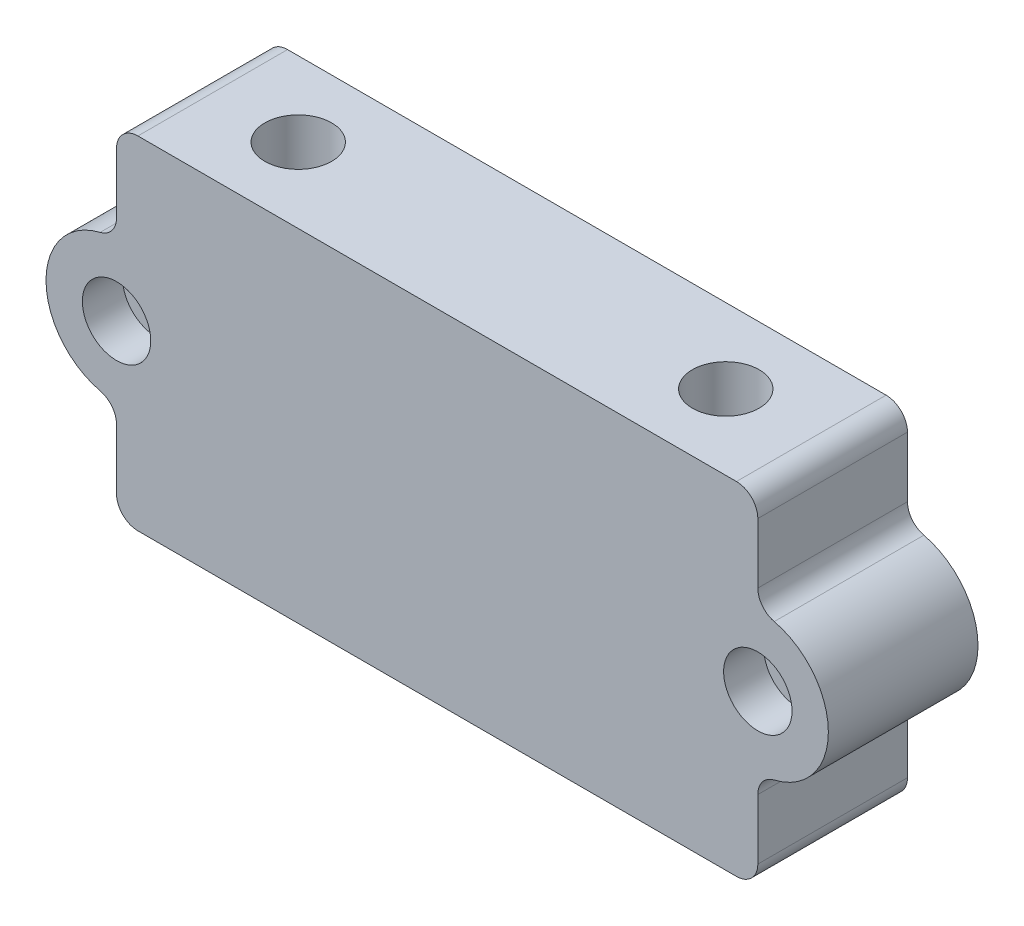
ISO-10303-21;
HEADER;
FILE_DESCRIPTION(('STEP AP214'),'2;1');
FILE_NAME('part.step','',(''),(''),'','','');
FILE_SCHEMA(('AUTOMOTIVE_DESIGN { 1 0 10303 214 1 1 1 1 }'));
ENDSEC;
DATA;
#1=APPLICATION_CONTEXT('core data for automotive mechanical design processes');
#2=APPLICATION_PROTOCOL_DEFINITION('international standard','automotive_design',2000,#1);
#3=PRODUCT_CONTEXT('',#1,'mechanical');
#4=PRODUCT('Part','Part','',(#3));
#5=PRODUCT_RELATED_PRODUCT_CATEGORY('part','',(#4));
#6=PRODUCT_DEFINITION_FORMATION('','',#4);
#7=PRODUCT_DEFINITION_CONTEXT('part definition',#1,'design');
#8=PRODUCT_DEFINITION('design','',#6,#7);
#9=PRODUCT_DEFINITION_SHAPE('','',#8);
#10=(LENGTH_UNIT() NAMED_UNIT(*) SI_UNIT(.MILLI.,.METRE.));
#11=(NAMED_UNIT(*) PLANE_ANGLE_UNIT() SI_UNIT($,.RADIAN.));
#12=(NAMED_UNIT(*) SI_UNIT($,.STERADIAN.) SOLID_ANGLE_UNIT());
#13=UNCERTAINTY_MEASURE_WITH_UNIT(LENGTH_MEASURE(1.E-05),#10,'distance_accuracy_value','');
#14=(GEOMETRIC_REPRESENTATION_CONTEXT(3) GLOBAL_UNCERTAINTY_ASSIGNED_CONTEXT((#13)) GLOBAL_UNIT_ASSIGNED_CONTEXT((#10,
#11,#12)) REPRESENTATION_CONTEXT('',''));
#15=CARTESIAN_POINT('',(0.,0.,0.));
#16=DIRECTION('',(0.,0.,1.));
#17=DIRECTION('',(1.,0.,0.));
#18=AXIS2_PLACEMENT_3D('',#15,#16,#17);
#19=CARTESIAN_POINT('',(-84.93125,0.,-17.78));
#20=DIRECTION('',(0.,0.,1.));
#21=DIRECTION('',(1.,0.,0.));
#22=AXIS2_PLACEMENT_3D('',#19,#20,#21);
#23=CYLINDRICAL_SURFACE('',#22,2.4892);
#24=CARTESIAN_POINT('',(-84.93125,0.,-17.78));
#25=DIRECTION('',(0.,0.,1.));
#26=DIRECTION('',(1.,0.,0.));
#27=AXIS2_PLACEMENT_3D('',#24,#25,#26);
#28=CIRCLE('',#27,2.4892);
#29=CARTESIAN_POINT('',(-82.44205,0.,-17.78));
#30=VERTEX_POINT('',#29);
#31=EDGE_CURVE('E261',#30,#30,#28,.T.);
#32=ORIENTED_EDGE('',*,*,#31,.F.);
#33=EDGE_LOOP('',(#32));
#34=FACE_BOUND('',#33,.T.);
#35=CARTESIAN_POINT('',(-84.93125,0.,-4.7752));
#36=DIRECTION('',(0.,0.,1.));
#37=DIRECTION('',(1.,0.,0.));
#38=AXIS2_PLACEMENT_3D('',#35,#36,#37);
#39=CIRCLE('',#38,2.4892);
#40=CARTESIAN_POINT('',(-82.44205,0.,-4.7752));
#41=VERTEX_POINT('',#40);
#42=EDGE_CURVE('E44',#41,#41,#39,.F.);
#43=ORIENTED_EDGE('',*,*,#42,.F.);
#44=EDGE_LOOP('',(#43));
#45=FACE_BOUND('',#44,.T.);
#46=ADVANCED_FACE('F40',(#34,#45),#23,.F.);
#47=CARTESIAN_POINT('',(-8.73125,0.,-17.78));
#48=DIRECTION('',(0.,0.,1.));
#49=DIRECTION('',(1.,0.,0.));
#50=AXIS2_PLACEMENT_3D('',#47,#48,#49);
#51=CYLINDRICAL_SURFACE('',#50,2.4892);
#52=CARTESIAN_POINT('',(-8.73125,0.,-17.78));
#53=DIRECTION('',(0.,0.,1.));
#54=DIRECTION('',(1.,0.,0.));
#55=AXIS2_PLACEMENT_3D('',#52,#53,#54);
#56=CIRCLE('',#55,2.4892);
#57=CARTESIAN_POINT('',(-6.24204999999999,0.,-17.78));
#58=VERTEX_POINT('',#57);
#59=EDGE_CURVE('E244',#58,#58,#56,.T.);
#60=ORIENTED_EDGE('',*,*,#59,.F.);
#61=EDGE_LOOP('',(#60));
#62=FACE_BOUND('',#61,.T.);
#63=CARTESIAN_POINT('',(-8.73125,0.,-4.7752));
#64=DIRECTION('',(0.,0.,1.));
#65=DIRECTION('',(1.,0.,0.));
#66=AXIS2_PLACEMENT_3D('',#63,#64,#65);
#67=CIRCLE('',#66,2.4892);
#68=CARTESIAN_POINT('',(-6.24204999999999,0.,-4.7752));
#69=VERTEX_POINT('',#68);
#70=EDGE_CURVE('E323',#69,#69,#67,.F.);
#71=ORIENTED_EDGE('',*,*,#70,.F.);
#72=EDGE_LOOP('',(#71));
#73=FACE_BOUND('',#72,.T.);
#74=ADVANCED_FACE('F443',(#62,#73),#51,.F.);
#75=CARTESIAN_POINT('',(-93.6625,20.32,-17.78));
#76=DIRECTION('',(0.,1.,0.));
#77=DIRECTION('',(0.,0.,1.));
#78=AXIS2_PLACEMENT_3D('',#75,#76,#77);
#79=PLANE('',#78);
#80=DIRECTION('',(-1.,0.,0.));
#81=VECTOR('',#80,1.);
#82=CARTESIAN_POINT('',(-93.6625,20.32,0.));
#83=LINE('',#82,#81);
#84=CARTESIAN_POINT('',(-11.27125,20.32,0.));
#85=VERTEX_POINT('',#84);
#86=CARTESIAN_POINT('',(-82.39125,20.32,0.));
#87=VERTEX_POINT('',#86);
#88=EDGE_CURVE('E265',#85,#87,#83,.T.);
#89=ORIENTED_EDGE('',*,*,#88,.F.);
#90=DIRECTION('',(0.,0.,1.));
#91=VECTOR('',#90,1.);
#92=CARTESIAN_POINT('',(-11.27125,20.32,-17.78));
#93=LINE('',#92,#91);
#94=CARTESIAN_POINT('',(-11.27125,20.32,-17.78));
#95=VERTEX_POINT('',#94);
#96=EDGE_CURVE('E319',#85,#95,#93,.F.);
#97=ORIENTED_EDGE('',*,*,#96,.T.);
#98=DIRECTION('',(-1.,0.,0.));
#99=VECTOR('',#98,1.);
#100=CARTESIAN_POINT('',(-93.6625,20.32,-17.78));
#101=LINE('',#100,#99);
#102=CARTESIAN_POINT('',(-82.39125,20.32,-17.78));
#103=VERTEX_POINT('',#102);
#104=EDGE_CURVE('E266',#95,#103,#101,.T.);
#105=ORIENTED_EDGE('',*,*,#104,.T.);
#106=DIRECTION('',(0.,0.,1.));
#107=VECTOR('',#106,1.);
#108=CARTESIAN_POINT('',(-82.39125,20.32,0.));
#109=LINE('',#108,#107);
#110=EDGE_CURVE('E315',#103,#87,#109,.T.);
#111=ORIENTED_EDGE('',*,*,#110,.T.);
#112=EDGE_LOOP('',(#89,#97,#105,#111));
#113=FACE_BOUND('',#112,.T.);
#114=CARTESIAN_POINT('',(-72.23125,20.32,-8.89));
#115=DIRECTION('',(0.,1.,0.));
#116=DIRECTION('',(0.,0.,1.));
#117=AXIS2_PLACEMENT_3D('',#114,#115,#116);
#118=CIRCLE('',#117,3.96874999999999);
#119=CARTESIAN_POINT('',(-72.23125,20.32,-4.92125000000001));
#120=VERTEX_POINT('',#119);
#121=EDGE_CURVE('E245',#120,#120,#118,.T.);
#122=ORIENTED_EDGE('',*,*,#121,.F.);
#123=EDGE_LOOP('',(#122));
#124=FACE_BOUND('',#123,.T.);
#125=CARTESIAN_POINT('',(-21.43125,20.32,-8.89));
#126=DIRECTION('',(0.,1.,0.));
#127=DIRECTION('',(0.,0.,1.));
#128=AXIS2_PLACEMENT_3D('',#125,#126,#127);
#129=CIRCLE('',#128,3.96875);
#130=CARTESIAN_POINT('',(-21.43125,20.32,-4.92125000000001));
#131=VERTEX_POINT('',#130);
#132=EDGE_CURVE('E253',#131,#131,#129,.T.);
#133=ORIENTED_EDGE('',*,*,#132,.F.);
#134=EDGE_LOOP('',(#133));
#135=FACE_BOUND('',#134,.T.);
#136=ADVANCED_FACE('F397',(#113,#124,#135),#79,.T.);
#137=CARTESIAN_POINT('',(-93.6625,-20.32,-17.78));
#138=DIRECTION('',(0.,-1.,0.));
#139=DIRECTION('',(0.,0.,-1.));
#140=AXIS2_PLACEMENT_3D('',#137,#138,#139);
#141=PLANE('',#140);
#142=DIRECTION('',(1.,0.,0.));
#143=VECTOR('',#142,1.);
#144=CARTESIAN_POINT('',(-93.6625,-20.32,-17.78));
#145=LINE('',#144,#143);
#146=CARTESIAN_POINT('',(-82.39125,-20.32,-17.78));
#147=VERTEX_POINT('',#146);
#148=CARTESIAN_POINT('',(-11.2712500000001,-20.32,-17.78));
#149=VERTEX_POINT('',#148);
#150=EDGE_CURVE('E269',#147,#149,#145,.T.);
#151=ORIENTED_EDGE('',*,*,#150,.T.);
#152=DIRECTION('',(0.,0.,1.));
#153=VECTOR('',#152,1.);
#154=CARTESIAN_POINT('',(-11.27125,-20.32,0.));
#155=LINE('',#154,#153);
#156=CARTESIAN_POINT('',(-11.2712500000001,-20.32,0.));
#157=VERTEX_POINT('',#156);
#158=EDGE_CURVE('E283',#149,#157,#155,.T.);
#159=ORIENTED_EDGE('',*,*,#158,.T.);
#160=DIRECTION('',(1.,0.,0.));
#161=VECTOR('',#160,1.);
#162=CARTESIAN_POINT('',(-93.6625,-20.32,0.));
#163=LINE('',#162,#161);
#164=CARTESIAN_POINT('',(-82.39125,-20.32,0.));
#165=VERTEX_POINT('',#164);
#166=EDGE_CURVE('E270',#165,#157,#163,.T.);
#167=ORIENTED_EDGE('',*,*,#166,.F.);
#168=DIRECTION('',(0.,0.,1.));
#169=VECTOR('',#168,1.);
#170=CARTESIAN_POINT('',(-82.39125,-20.32,-17.78));
#171=LINE('',#170,#169);
#172=EDGE_CURVE('E274',#165,#147,#171,.F.);
#173=ORIENTED_EDGE('',*,*,#172,.T.);
#174=EDGE_LOOP('',(#151,#159,#167,#173));
#175=FACE_BOUND('',#174,.T.);
#176=CARTESIAN_POINT('',(-72.23125,-20.32,-8.89));
#177=DIRECTION('',(0.,1.,0.));
#178=DIRECTION('',(0.,0.,1.));
#179=AXIS2_PLACEMENT_3D('',#176,#177,#178);
#180=CIRCLE('',#179,3.96874999999999);
#181=CARTESIAN_POINT('',(-72.23125,-20.32,-4.92125000000001));
#182=VERTEX_POINT('',#181);
#183=EDGE_CURVE('E240',#182,#182,#180,.T.);
#184=ORIENTED_EDGE('',*,*,#183,.T.);
#185=EDGE_LOOP('',(#184));
#186=FACE_BOUND('',#185,.T.);
#187=CARTESIAN_POINT('',(-21.43125,-20.32,-8.89));
#188=DIRECTION('',(0.,1.,0.));
#189=DIRECTION('',(0.,0.,1.));
#190=AXIS2_PLACEMENT_3D('',#187,#188,#189);
#191=CIRCLE('',#190,3.96875);
#192=CARTESIAN_POINT('',(-21.43125,-20.32,-4.92125000000001));
#193=VERTEX_POINT('',#192);
#194=EDGE_CURVE('E249',#193,#193,#191,.T.);
#195=ORIENTED_EDGE('',*,*,#194,.T.);
#196=EDGE_LOOP('',(#195));
#197=FACE_BOUND('',#196,.T.);
#198=ADVANCED_FACE('F430',(#175,#186,#197),#141,.T.);
#199=CARTESIAN_POINT('',(0.,0.,-17.78));
#200=DIRECTION('',(0.,0.,-1.));
#201=DIRECTION('',(-1.,0.,0.));
#202=AXIS2_PLACEMENT_3D('',#199,#200,#201);
#203=PLANE('',#202);
#204=DIRECTION('',(0.,-1.,0.));
#205=VECTOR('',#204,1.);
#206=CARTESIAN_POINT('',(-8.73125000000001,-10.6225460224938,-17.78));
#207=LINE('',#206,#205);
#208=CARTESIAN_POINT('',(-8.73125,-10.6225460224938,-17.78));
#209=VERTEX_POINT('',#208);
#210=CARTESIAN_POINT('',(-8.73125000000004,-17.78,-17.78));
#211=VERTEX_POINT('',#210);
#212=EDGE_CURVE('E209',#209,#211,#207,.T.);
#213=ORIENTED_EDGE('',*,*,#212,.T.);
#214=CARTESIAN_POINT('',(-11.27125,-17.78,-17.78));
#215=DIRECTION('',(0.,0.,-1.));
#216=DIRECTION('',(-1.,0.,0.));
#217=AXIS2_PLACEMENT_3D('',#214,#215,#216);
#218=CIRCLE('',#217,2.54);
#219=EDGE_CURVE('E308',#211,#149,#218,.T.);
#220=ORIENTED_EDGE('',*,*,#219,.T.);
#221=ORIENTED_EDGE('',*,*,#150,.F.);
#222=CARTESIAN_POINT('',(-82.39125,-17.78,-17.78));
#223=DIRECTION('',(0.,0.,-1.));
#224=DIRECTION('',(-1.,0.,0.));
#225=AXIS2_PLACEMENT_3D('',#222,#223,#224);
#226=CIRCLE('',#225,2.54);
#227=CARTESIAN_POINT('',(-84.93125,-17.78,-17.78));
#228=VERTEX_POINT('',#227);
#229=EDGE_CURVE('E165',#147,#228,#226,.T.);
#230=ORIENTED_EDGE('',*,*,#229,.T.);
#231=DIRECTION('',(0.,1.,0.));
#232=VECTOR('',#231,1.);
#233=CARTESIAN_POINT('',(-84.93125,-10.6225460224939,-17.78));
#234=LINE('',#233,#232);
#235=CARTESIAN_POINT('',(-84.93125,-10.6225460224939,-17.78));
#236=VERTEX_POINT('',#235);
#237=EDGE_CURVE('E156',#228,#236,#234,.T.);
#238=ORIENTED_EDGE('',*,*,#237,.T.);
#239=CARTESIAN_POINT('',(-87.47125,-10.6225460224939,-17.78));
#240=DIRECTION('',(0.,0.,-1.));
#241=DIRECTION('',(-1.,0.,0.));
#242=AXIS2_PLACEMENT_3D('',#239,#240,#241);
#243=CIRCLE('',#242,2.54000000000001);
#244=CARTESIAN_POINT('',(-86.8805523255814,-8.152186482379,-17.78));
#245=VERTEX_POINT('',#244);
#246=EDGE_CURVE('E162',#236,#245,#243,.F.);
#247=ORIENTED_EDGE('',*,*,#246,.T.);
#248=CARTESIAN_POINT('',(-84.93125,0.,-17.78));
#249=DIRECTION('',(0.,0.,-1.));
#250=DIRECTION('',(-1.,0.,0.));
#251=AXIS2_PLACEMENT_3D('',#248,#249,#250);
#252=CIRCLE('',#251,8.382);
#253=CARTESIAN_POINT('',(-86.8805523255814,8.152186482379,-17.78));
#254=VERTEX_POINT('',#253);
#255=EDGE_CURVE('E372',#245,#254,#252,.T.);
#256=ORIENTED_EDGE('',*,*,#255,.T.);
#257=CARTESIAN_POINT('',(-87.47125,10.6225460224939,-17.78));
#258=DIRECTION('',(0.,0.,-1.));
#259=DIRECTION('',(-1.,0.,0.));
#260=AXIS2_PLACEMENT_3D('',#257,#258,#259);
#261=CIRCLE('',#260,2.54000000000001);
#262=CARTESIAN_POINT('',(-84.93125,10.6225460224939,-17.78));
#263=VERTEX_POINT('',#262);
#264=EDGE_CURVE('E367',#254,#263,#261,.F.);
#265=ORIENTED_EDGE('',*,*,#264,.T.);
#266=DIRECTION('',(0.,1.,0.));
#267=VECTOR('',#266,1.);
#268=CARTESIAN_POINT('',(-84.93125,10.6225460224939,-17.78));
#269=LINE('',#268,#267);
#270=CARTESIAN_POINT('',(-84.93125,17.78,-17.78));
#271=VERTEX_POINT('',#270);
#272=EDGE_CURVE('E257',#263,#271,#269,.T.);
#273=ORIENTED_EDGE('',*,*,#272,.T.);
#274=CARTESIAN_POINT('',(-82.39125,17.78,-17.78));
#275=DIRECTION('',(0.,0.,-1.));
#276=DIRECTION('',(-1.,0.,0.));
#277=AXIS2_PLACEMENT_3D('',#274,#275,#276);
#278=CIRCLE('',#277,2.54);
#279=EDGE_CURVE('E64',#271,#103,#278,.T.);
#280=ORIENTED_EDGE('',*,*,#279,.T.);
#281=ORIENTED_EDGE('',*,*,#104,.F.);
#282=CARTESIAN_POINT('',(-11.27125,17.78,-17.78));
#283=DIRECTION('',(0.,0.,-1.));
#284=DIRECTION('',(-1.,0.,0.));
#285=AXIS2_PLACEMENT_3D('',#282,#283,#284);
#286=CIRCLE('',#285,2.54);
#287=CARTESIAN_POINT('',(-8.73124999999999,17.78,-17.78));
#288=VERTEX_POINT('',#287);
#289=EDGE_CURVE('E58',#95,#288,#286,.T.);
#290=ORIENTED_EDGE('',*,*,#289,.T.);
#291=DIRECTION('',(0.,-1.,0.));
#292=VECTOR('',#291,1.);
#293=CARTESIAN_POINT('',(-8.73124999999998,10.6225460224939,-17.78));
#294=LINE('',#293,#292);
#295=CARTESIAN_POINT('',(-8.73124999999998,10.6225460224939,-17.78));
#296=VERTEX_POINT('',#295);
#297=EDGE_CURVE('E194',#288,#296,#294,.T.);
#298=ORIENTED_EDGE('',*,*,#297,.T.);
#299=CARTESIAN_POINT('',(-6.19124999999997,10.6225460224939,-17.78));
#300=DIRECTION('',(0.,0.,-1.));
#301=DIRECTION('',(-1.,0.,0.));
#302=AXIS2_PLACEMENT_3D('',#299,#300,#301);
#303=CIRCLE('',#302,2.54000000000001);
#304=CARTESIAN_POINT('',(-6.78194767441858,8.15218648237901,-17.78));
#305=VERTEX_POINT('',#304);
#306=EDGE_CURVE('E223',#296,#305,#303,.F.);
#307=ORIENTED_EDGE('',*,*,#306,.T.);
#308=CARTESIAN_POINT('',(-8.73125,0.,-17.78));
#309=DIRECTION('',(0.,0.,-1.));
#310=DIRECTION('',(-1.,0.,0.));
#311=AXIS2_PLACEMENT_3D('',#308,#309,#310);
#312=CIRCLE('',#311,8.382);
#313=CARTESIAN_POINT('',(-6.7819476744186,-8.152186482379,-17.78));
#314=VERTEX_POINT('',#313);
#315=EDGE_CURVE('E218',#305,#314,#312,.T.);
#316=ORIENTED_EDGE('',*,*,#315,.T.);
#317=CARTESIAN_POINT('',(-6.19125,-10.6225460224938,-17.78));
#318=DIRECTION('',(0.,0.,-1.));
#319=DIRECTION('',(-1.,0.,0.));
#320=AXIS2_PLACEMENT_3D('',#317,#318,#319);
#321=CIRCLE('',#320,2.54000000000001);
#322=EDGE_CURVE('E213',#314,#209,#321,.F.);
#323=ORIENTED_EDGE('',*,*,#322,.T.);
#324=EDGE_LOOP('',(#213,#220,#221,#230,#238,#247,#256,#265,#273,#280,#281,#290,#298,#307,#316,#323));
#325=FACE_BOUND('',#324,.T.);
#326=ORIENTED_EDGE('',*,*,#59,.T.);
#327=EDGE_LOOP('',(#326));
#328=FACE_BOUND('',#327,.T.);
#329=ORIENTED_EDGE('',*,*,#31,.T.);
#330=EDGE_LOOP('',(#329));
#331=FACE_BOUND('',#330,.T.);
#332=ADVANCED_FACE('F159',(#325,#328,#331),#203,.T.);
#333=CARTESIAN_POINT('',(0.,0.,0.));
#334=DIRECTION('',(0.,0.,-1.));
#335=DIRECTION('',(-1.,0.,0.));
#336=AXIS2_PLACEMENT_3D('',#333,#334,#335);
#337=PLANE('',#336);
#338=CARTESIAN_POINT('',(-8.73125,0.,0.));
#339=DIRECTION('',(0.,0.,1.));
#340=DIRECTION('',(1.,0.,0.));
#341=AXIS2_PLACEMENT_3D('',#338,#339,#340);
#342=CIRCLE('',#341,4.06400000000002);
#343=CARTESIAN_POINT('',(-4.66724999999998,0.,0.));
#344=VERTEX_POINT('',#343);
#345=EDGE_CURVE('E333',#344,#344,#342,.T.);
#346=ORIENTED_EDGE('',*,*,#345,.F.);
#347=EDGE_LOOP('',(#346));
#348=FACE_BOUND('',#347,.T.);
#349=CARTESIAN_POINT('',(-84.93125,0.,0.));
#350=DIRECTION('',(0.,0.,1.));
#351=DIRECTION('',(1.,0.,0.));
#352=AXIS2_PLACEMENT_3D('',#349,#350,#351);
#353=CIRCLE('',#352,4.06400000000002);
#354=CARTESIAN_POINT('',(-80.86725,0.,0.));
#355=VERTEX_POINT('',#354);
#356=EDGE_CURVE('E345',#355,#355,#353,.T.);
#357=ORIENTED_EDGE('',*,*,#356,.F.);
#358=EDGE_LOOP('',(#357));
#359=FACE_BOUND('',#358,.T.);
#360=ORIENTED_EDGE('',*,*,#166,.T.);
#361=CARTESIAN_POINT('',(-11.27125,-17.78,0.));
#362=DIRECTION('',(0.,0.,-1.));
#363=DIRECTION('',(-1.,0.,0.));
#364=AXIS2_PLACEMENT_3D('',#361,#362,#363);
#365=CIRCLE('',#364,2.54);
#366=CARTESIAN_POINT('',(-8.73125000000004,-17.78,0.));
#367=VERTEX_POINT('',#366);
#368=EDGE_CURVE('E296',#157,#367,#365,.F.);
#369=ORIENTED_EDGE('',*,*,#368,.T.);
#370=DIRECTION('',(0.,-1.,0.));
#371=VECTOR('',#370,1.);
#372=CARTESIAN_POINT('',(-8.73125000000001,-10.6225460224938,0.));
#373=LINE('',#372,#371);
#374=CARTESIAN_POINT('',(-8.73125000000001,-10.6225460224938,0.));
#375=VERTEX_POINT('',#374);
#376=EDGE_CURVE('E190',#375,#367,#373,.T.);
#377=ORIENTED_EDGE('',*,*,#376,.F.);
#378=CARTESIAN_POINT('',(-6.19125,-10.6225460224938,0.));
#379=DIRECTION('',(0.,0.,1.));
#380=DIRECTION('',(-1.,0.,0.));
#381=AXIS2_PLACEMENT_3D('',#378,#379,#380);
#382=CIRCLE('',#381,2.54000000000001);
#383=CARTESIAN_POINT('',(-6.7819476744186,-8.152186482379,0.));
#384=VERTEX_POINT('',#383);
#385=EDGE_CURVE('E195',#384,#375,#382,.T.);
#386=ORIENTED_EDGE('',*,*,#385,.F.);
#387=CARTESIAN_POINT('',(-8.73125,0.,0.));
#388=DIRECTION('',(0.,0.,-1.));
#389=DIRECTION('',(-1.,0.,0.));
#390=AXIS2_PLACEMENT_3D('',#387,#388,#389);
#391=CIRCLE('',#390,8.382);
#392=CARTESIAN_POINT('',(-6.78194767441858,8.15218648237901,0.));
#393=VERTEX_POINT('',#392);
#394=EDGE_CURVE('E198',#393,#384,#391,.T.);
#395=ORIENTED_EDGE('',*,*,#394,.F.);
#396=CARTESIAN_POINT('',(-6.19124999999997,10.6225460224939,0.));
#397=DIRECTION('',(0.,0.,1.));
#398=DIRECTION('',(1.,0.,0.));
#399=AXIS2_PLACEMENT_3D('',#396,#397,#398);
#400=CIRCLE('',#399,2.54000000000001);
#401=CARTESIAN_POINT('',(-8.73124999999998,10.6225460224939,0.));
#402=VERTEX_POINT('',#401);
#403=EDGE_CURVE('E202',#402,#393,#400,.T.);
#404=ORIENTED_EDGE('',*,*,#403,.F.);
#405=DIRECTION('',(0.,-1.,0.));
#406=VECTOR('',#405,1.);
#407=CARTESIAN_POINT('',(-8.73124999999998,10.6225460224939,0.));
#408=LINE('',#407,#406);
#409=CARTESIAN_POINT('',(-8.73124999999999,17.78,0.));
#410=VERTEX_POINT('',#409);
#411=EDGE_CURVE('E206',#410,#402,#408,.T.);
#412=ORIENTED_EDGE('',*,*,#411,.F.);
#413=CARTESIAN_POINT('',(-11.27125,17.78,0.));
#414=DIRECTION('',(0.,0.,-1.));
#415=DIRECTION('',(-1.,0.,0.));
#416=AXIS2_PLACEMENT_3D('',#413,#414,#415);
#417=CIRCLE('',#416,2.54);
#418=EDGE_CURVE('E293',#410,#85,#417,.F.);
#419=ORIENTED_EDGE('',*,*,#418,.T.);
#420=ORIENTED_EDGE('',*,*,#88,.T.);
#421=CARTESIAN_POINT('',(-82.39125,17.78,0.));
#422=DIRECTION('',(0.,0.,-1.));
#423=DIRECTION('',(-1.,0.,0.));
#424=AXIS2_PLACEMENT_3D('',#421,#422,#423);
#425=CIRCLE('',#424,2.54);
#426=CARTESIAN_POINT('',(-84.93125,17.78,0.));
#427=VERTEX_POINT('',#426);
#428=EDGE_CURVE('E290',#87,#427,#425,.F.);
#429=ORIENTED_EDGE('',*,*,#428,.T.);
#430=DIRECTION('',(0.,1.,0.));
#431=VECTOR('',#430,1.);
#432=CARTESIAN_POINT('',(-84.93125,10.6225460224939,0.));
#433=LINE('',#432,#431);
#434=CARTESIAN_POINT('',(-84.93125,10.6225460224939,0.));
#435=VERTEX_POINT('',#434);
#436=EDGE_CURVE('E171',#435,#427,#433,.T.);
#437=ORIENTED_EDGE('',*,*,#436,.F.);
#438=CARTESIAN_POINT('',(-87.47125,10.6225460224939,0.));
#439=DIRECTION('',(0.,0.,1.));
#440=DIRECTION('',(-1.,0.,0.));
#441=AXIS2_PLACEMENT_3D('',#438,#439,#440);
#442=CIRCLE('',#441,2.54000000000001);
#443=CARTESIAN_POINT('',(-86.8805523255814,8.152186482379,0.));
#444=VERTEX_POINT('',#443);
#445=EDGE_CURVE('E352',#444,#435,#442,.T.);
#446=ORIENTED_EDGE('',*,*,#445,.F.);
#447=CARTESIAN_POINT('',(-84.93125,0.,0.));
#448=DIRECTION('',(0.,0.,-1.));
#449=DIRECTION('',(1.,0.,0.));
#450=AXIS2_PLACEMENT_3D('',#447,#448,#449);
#451=CIRCLE('',#450,8.382);
#452=CARTESIAN_POINT('',(-86.8805523255814,-8.152186482379,0.));
#453=VERTEX_POINT('',#452);
#454=EDGE_CURVE('E355',#453,#444,#451,.T.);
#455=ORIENTED_EDGE('',*,*,#454,.F.);
#456=CARTESIAN_POINT('',(-87.47125,-10.6225460224939,0.));
#457=DIRECTION('',(0.,0.,1.));
#458=DIRECTION('',(1.,0.,0.));
#459=AXIS2_PLACEMENT_3D('',#456,#457,#458);
#460=CIRCLE('',#459,2.54000000000001);
#461=CARTESIAN_POINT('',(-84.93125,-10.6225460224939,0.));
#462=VERTEX_POINT('',#461);
#463=EDGE_CURVE('E359',#462,#453,#460,.T.);
#464=ORIENTED_EDGE('',*,*,#463,.F.);
#465=DIRECTION('',(0.,1.,0.));
#466=VECTOR('',#465,1.);
#467=CARTESIAN_POINT('',(-84.93125,-10.6225460224939,0.));
#468=LINE('',#467,#466);
#469=CARTESIAN_POINT('',(-84.93125,-17.78,0.));
#470=VERTEX_POINT('',#469);
#471=EDGE_CURVE('E184',#470,#462,#468,.T.);
#472=ORIENTED_EDGE('',*,*,#471,.F.);
#473=CARTESIAN_POINT('',(-82.39125,-17.78,0.));
#474=DIRECTION('',(0.,0.,-1.));
#475=DIRECTION('',(-1.,0.,0.));
#476=AXIS2_PLACEMENT_3D('',#473,#474,#475);
#477=CIRCLE('',#476,2.54);
#478=EDGE_CURVE('E287',#470,#165,#477,.F.);
#479=ORIENTED_EDGE('',*,*,#478,.T.);
#480=EDGE_LOOP('',(#360,#369,#377,#386,#395,#404,#412,#419,#420,#429,#437,#446,#455,#464,#472,#479));
#481=FACE_BOUND('',#480,.T.);
#482=ADVANCED_FACE('F388',(#348,#359,#481),#337,.F.);
#483=CARTESIAN_POINT('',(-21.43125,-20.32,-8.89));
#484=DIRECTION('',(0.,1.,0.));
#485=DIRECTION('',(0.,0.,1.));
#486=AXIS2_PLACEMENT_3D('',#483,#484,#485);
#487=CYLINDRICAL_SURFACE('',#486,3.96875);
#488=ORIENTED_EDGE('',*,*,#194,.F.);
#489=EDGE_LOOP('',(#488));
#490=FACE_BOUND('',#489,.T.);
#491=ORIENTED_EDGE('',*,*,#132,.T.);
#492=EDGE_LOOP('',(#491));
#493=FACE_BOUND('',#492,.T.);
#494=ADVANCED_FACE('F459',(#490,#493),#487,.F.);
#495=CARTESIAN_POINT('',(-72.23125,-20.32,-8.89));
#496=DIRECTION('',(0.,1.,0.));
#497=DIRECTION('',(0.,0.,1.));
#498=AXIS2_PLACEMENT_3D('',#495,#496,#497);
#499=CYLINDRICAL_SURFACE('',#498,3.96874999999999);
#500=ORIENTED_EDGE('',*,*,#183,.F.);
#501=EDGE_LOOP('',(#500));
#502=FACE_BOUND('',#501,.T.);
#503=ORIENTED_EDGE('',*,*,#121,.T.);
#504=EDGE_LOOP('',(#503));
#505=FACE_BOUND('',#504,.T.);
#506=ADVANCED_FACE('F561',(#502,#505),#499,.F.);
#507=CARTESIAN_POINT('',(-8.73124999999998,10.6225460224939,-59.3473468790409));
#508=DIRECTION('',(-1.,0.,0.));
#509=DIRECTION('',(0.,-1.,0.));
#510=AXIS2_PLACEMENT_3D('',#507,#508,#509);
#511=PLANE('',#510);
#512=ORIENTED_EDGE('',*,*,#297,.F.);
#513=DIRECTION('',(0.,0.,1.));
#514=VECTOR('',#513,1.);
#515=CARTESIAN_POINT('',(-8.73124999999999,17.78,0.));
#516=LINE('',#515,#514);
#517=EDGE_CURVE('E311',#288,#410,#516,.T.);
#518=ORIENTED_EDGE('',*,*,#517,.T.);
#519=ORIENTED_EDGE('',*,*,#411,.T.);
#520=DIRECTION('',(0.,0.,1.));
#521=VECTOR('',#520,1.);
#522=CARTESIAN_POINT('',(-8.73124999999998,10.6225460224939,-59.3473468790409));
#523=LINE('',#522,#521);
#524=EDGE_CURVE('E227',#296,#402,#523,.T.);
#525=ORIENTED_EDGE('',*,*,#524,.F.);
#526=EDGE_LOOP('',(#512,#518,#519,#525));
#527=FACE_BOUND('',#526,.T.);
#528=ADVANCED_FACE('F406',(#527),#511,.F.);
#529=CARTESIAN_POINT('',(-6.19124999999997,10.6225460224939,-59.3473468790409));
#530=DIRECTION('',(0.,0.,1.));
#531=DIRECTION('',(1.,0.,0.));
#532=AXIS2_PLACEMENT_3D('',#529,#530,#531);
#533=CYLINDRICAL_SURFACE('',#532,2.54000000000001);
#534=ORIENTED_EDGE('',*,*,#524,.T.);
#535=ORIENTED_EDGE('',*,*,#403,.T.);
#536=DIRECTION('',(0.,0.,1.));
#537=VECTOR('',#536,1.);
#538=CARTESIAN_POINT('',(-6.78194767441858,8.15218648237901,-59.3473468790409));
#539=LINE('',#538,#537);
#540=EDGE_CURVE('E222',#305,#393,#539,.T.);
#541=ORIENTED_EDGE('',*,*,#540,.F.);
#542=ORIENTED_EDGE('',*,*,#306,.F.);
#543=EDGE_LOOP('',(#534,#535,#541,#542));
#544=FACE_BOUND('',#543,.T.);
#545=ADVANCED_FACE('F411',(#544),#533,.F.);
#546=CARTESIAN_POINT('',(-8.73125,0.,-59.3473468790409));
#547=DIRECTION('',(0.,0.,1.));
#548=DIRECTION('',(1.,0.,0.));
#549=AXIS2_PLACEMENT_3D('',#546,#547,#548);
#550=CYLINDRICAL_SURFACE('',#549,8.382);
#551=ORIENTED_EDGE('',*,*,#540,.T.);
#552=ORIENTED_EDGE('',*,*,#394,.T.);
#553=DIRECTION('',(0.,0.,1.));
#554=VECTOR('',#553,1.);
#555=CARTESIAN_POINT('',(-6.7819476744186,-8.152186482379,-59.3473468790409));
#556=LINE('',#555,#554);
#557=EDGE_CURVE('E217',#314,#384,#556,.T.);
#558=ORIENTED_EDGE('',*,*,#557,.F.);
#559=ORIENTED_EDGE('',*,*,#315,.F.);
#560=EDGE_LOOP('',(#551,#552,#558,#559));
#561=FACE_BOUND('',#560,.T.);
#562=ADVANCED_FACE('F414',(#561),#550,.T.);
#563=CARTESIAN_POINT('',(-6.19125,-10.6225460224938,-59.3473468790409));
#564=DIRECTION('',(0.,0.,1.));
#565=DIRECTION('',(1.,0.,0.));
#566=AXIS2_PLACEMENT_3D('',#563,#564,#565);
#567=CYLINDRICAL_SURFACE('',#566,2.54000000000001);
#568=ORIENTED_EDGE('',*,*,#557,.T.);
#569=ORIENTED_EDGE('',*,*,#385,.T.);
#570=DIRECTION('',(0.,0.,1.));
#571=VECTOR('',#570,1.);
#572=CARTESIAN_POINT('',(-8.73125,-10.6225460224938,-59.3473468790409));
#573=LINE('',#572,#571);
#574=EDGE_CURVE('E212',#209,#375,#573,.T.);
#575=ORIENTED_EDGE('',*,*,#574,.F.);
#576=ORIENTED_EDGE('',*,*,#322,.F.);
#577=EDGE_LOOP('',(#568,#569,#575,#576));
#578=FACE_BOUND('',#577,.T.);
#579=ADVANCED_FACE('F420',(#578),#567,.F.);
#580=CARTESIAN_POINT('',(-8.73125000000001,-10.6225460224938,-59.3473468790409));
#581=DIRECTION('',(-1.,0.,0.));
#582=DIRECTION('',(0.,-1.,0.));
#583=AXIS2_PLACEMENT_3D('',#580,#581,#582);
#584=PLANE('',#583);
#585=ORIENTED_EDGE('',*,*,#376,.T.);
#586=DIRECTION('',(0.,0.,1.));
#587=VECTOR('',#586,1.);
#588=CARTESIAN_POINT('',(-8.73125000000004,-17.78,-17.78));
#589=LINE('',#588,#587);
#590=EDGE_CURVE('E299',#367,#211,#589,.F.);
#591=ORIENTED_EDGE('',*,*,#590,.T.);
#592=ORIENTED_EDGE('',*,*,#212,.F.);
#593=ORIENTED_EDGE('',*,*,#574,.T.);
#594=EDGE_LOOP('',(#585,#591,#592,#593));
#595=FACE_BOUND('',#594,.T.);
#596=ADVANCED_FACE('F423',(#595),#584,.F.);
#597=CARTESIAN_POINT('',(-84.93125,-10.6225460224939,-59.3473468790409));
#598=DIRECTION('',(1.,0.,0.));
#599=DIRECTION('',(0.,1.,0.));
#600=AXIS2_PLACEMENT_3D('',#597,#598,#599);
#601=PLANE('',#600);
#602=ORIENTED_EDGE('',*,*,#237,.F.);
#603=DIRECTION('',(0.,0.,1.));
#604=VECTOR('',#603,1.);
#605=CARTESIAN_POINT('',(-84.93125,-17.78,0.));
#606=LINE('',#605,#604);
#607=EDGE_CURVE('E11',#228,#470,#606,.T.);
#608=ORIENTED_EDGE('',*,*,#607,.T.);
#609=ORIENTED_EDGE('',*,*,#471,.T.);
#610=DIRECTION('',(0.,0.,1.));
#611=VECTOR('',#610,1.);
#612=CARTESIAN_POINT('',(-84.93125,-10.6225460224939,-59.3473468790409));
#613=LINE('',#612,#611);
#614=EDGE_CURVE('E170',#236,#462,#613,.T.);
#615=ORIENTED_EDGE('',*,*,#614,.F.);
#616=EDGE_LOOP('',(#602,#608,#609,#615));
#617=FACE_BOUND('',#616,.T.);
#618=ADVANCED_FACE('F182',(#617),#601,.F.);
#619=CARTESIAN_POINT('',(-87.47125,-10.6225460224939,-59.3473468790409));
#620=DIRECTION('',(0.,0.,1.));
#621=DIRECTION('',(1.,0.,0.));
#622=AXIS2_PLACEMENT_3D('',#619,#620,#621);
#623=CYLINDRICAL_SURFACE('',#622,2.54000000000001);
#624=ORIENTED_EDGE('',*,*,#614,.T.);
#625=ORIENTED_EDGE('',*,*,#463,.T.);
#626=DIRECTION('',(0.,0.,1.));
#627=VECTOR('',#626,1.);
#628=CARTESIAN_POINT('',(-86.8805523255814,-8.152186482379,-59.3473468790409));
#629=LINE('',#628,#627);
#630=EDGE_CURVE('E179',#245,#453,#629,.T.);
#631=ORIENTED_EDGE('',*,*,#630,.F.);
#632=ORIENTED_EDGE('',*,*,#246,.F.);
#633=EDGE_LOOP('',(#624,#625,#631,#632));
#634=FACE_BOUND('',#633,.T.);
#635=ADVANCED_FACE('F176',(#634),#623,.F.);
#636=CARTESIAN_POINT('',(-84.93125,0.,-59.3473468790409));
#637=DIRECTION('',(0.,0.,1.));
#638=DIRECTION('',(1.,0.,0.));
#639=AXIS2_PLACEMENT_3D('',#636,#637,#638);
#640=CYLINDRICAL_SURFACE('',#639,8.382);
#641=ORIENTED_EDGE('',*,*,#630,.T.);
#642=ORIENTED_EDGE('',*,*,#454,.T.);
#643=DIRECTION('',(0.,0.,1.));
#644=VECTOR('',#643,1.);
#645=CARTESIAN_POINT('',(-86.8805523255814,8.152186482379,-59.3473468790409));
#646=LINE('',#645,#644);
#647=EDGE_CURVE('E371',#254,#444,#646,.T.);
#648=ORIENTED_EDGE('',*,*,#647,.F.);
#649=ORIENTED_EDGE('',*,*,#255,.F.);
#650=EDGE_LOOP('',(#641,#642,#648,#649));
#651=FACE_BOUND('',#650,.T.);
#652=ADVANCED_FACE('F385',(#651),#640,.T.);
#653=CARTESIAN_POINT('',(-87.47125,10.6225460224939,-59.3473468790409));
#654=DIRECTION('',(0.,0.,1.));
#655=DIRECTION('',(1.,0.,0.));
#656=AXIS2_PLACEMENT_3D('',#653,#654,#655);
#657=CYLINDRICAL_SURFACE('',#656,2.54000000000001);
#658=ORIENTED_EDGE('',*,*,#647,.T.);
#659=ORIENTED_EDGE('',*,*,#445,.T.);
#660=DIRECTION('',(0.,0.,1.));
#661=VECTOR('',#660,1.);
#662=CARTESIAN_POINT('',(-84.93125,10.6225460224939,-59.3473468790409));
#663=LINE('',#662,#661);
#664=EDGE_CURVE('E366',#263,#435,#663,.T.);
#665=ORIENTED_EDGE('',*,*,#664,.F.);
#666=ORIENTED_EDGE('',*,*,#264,.F.);
#667=EDGE_LOOP('',(#658,#659,#665,#666));
#668=FACE_BOUND('',#667,.T.);
#669=ADVANCED_FACE('F380',(#668),#657,.F.);
#670=CARTESIAN_POINT('',(-84.93125,10.6225460224939,-59.3473468790409));
#671=DIRECTION('',(1.,0.,0.));
#672=DIRECTION('',(0.,1.,0.));
#673=AXIS2_PLACEMENT_3D('',#670,#671,#672);
#674=PLANE('',#673);
#675=ORIENTED_EDGE('',*,*,#436,.T.);
#676=DIRECTION('',(0.,0.,1.));
#677=VECTOR('',#676,1.);
#678=CARTESIAN_POINT('',(-84.93125,17.78,-17.78));
#679=LINE('',#678,#677);
#680=EDGE_CURVE('E50',#427,#271,#679,.F.);
#681=ORIENTED_EDGE('',*,*,#680,.T.);
#682=ORIENTED_EDGE('',*,*,#272,.F.);
#683=ORIENTED_EDGE('',*,*,#664,.T.);
#684=EDGE_LOOP('',(#675,#681,#682,#683));
#685=FACE_BOUND('',#684,.T.);
#686=ADVANCED_FACE('F391',(#685),#674,.F.);
#687=CARTESIAN_POINT('',(-11.27125,-17.78,-17.78));
#688=DIRECTION('',(0.,0.,-1.));
#689=DIRECTION('',(-1.,0.,0.));
#690=AXIS2_PLACEMENT_3D('',#687,#688,#689);
#691=CYLINDRICAL_SURFACE('',#690,2.54);
#692=ORIENTED_EDGE('',*,*,#219,.F.);
#693=ORIENTED_EDGE('',*,*,#590,.F.);
#694=ORIENTED_EDGE('',*,*,#368,.F.);
#695=ORIENTED_EDGE('',*,*,#158,.F.);
#696=EDGE_LOOP('',(#692,#693,#694,#695));
#697=FACE_BOUND('',#696,.T.);
#698=ADVANCED_FACE('F428',(#697),#691,.T.);
#699=CARTESIAN_POINT('',(-11.27125,17.78,-59.3473468790409));
#700=DIRECTION('',(0.,0.,-1.));
#701=DIRECTION('',(-1.,0.,0.));
#702=AXIS2_PLACEMENT_3D('',#699,#700,#701);
#703=CYLINDRICAL_SURFACE('',#702,2.54);
#704=ORIENTED_EDGE('',*,*,#289,.F.);
#705=ORIENTED_EDGE('',*,*,#96,.F.);
#706=ORIENTED_EDGE('',*,*,#418,.F.);
#707=ORIENTED_EDGE('',*,*,#517,.F.);
#708=EDGE_LOOP('',(#704,#705,#706,#707));
#709=FACE_BOUND('',#708,.T.);
#710=ADVANCED_FACE('F404',(#709),#703,.T.);
#711=CARTESIAN_POINT('',(-82.39125,17.78,-17.78));
#712=DIRECTION('',(0.,0.,-1.));
#713=DIRECTION('',(-1.,0.,0.));
#714=AXIS2_PLACEMENT_3D('',#711,#712,#713);
#715=CYLINDRICAL_SURFACE('',#714,2.54);
#716=ORIENTED_EDGE('',*,*,#279,.F.);
#717=ORIENTED_EDGE('',*,*,#680,.F.);
#718=ORIENTED_EDGE('',*,*,#428,.F.);
#719=ORIENTED_EDGE('',*,*,#110,.F.);
#720=EDGE_LOOP('',(#716,#717,#718,#719));
#721=FACE_BOUND('',#720,.T.);
#722=ADVANCED_FACE('F393',(#721),#715,.T.);
#723=CARTESIAN_POINT('',(-82.39125,-17.78,-59.3473468790409));
#724=DIRECTION('',(0.,0.,-1.));
#725=DIRECTION('',(-1.,0.,0.));
#726=AXIS2_PLACEMENT_3D('',#723,#724,#725);
#727=CYLINDRICAL_SURFACE('',#726,2.54);
#728=ORIENTED_EDGE('',*,*,#229,.F.);
#729=ORIENTED_EDGE('',*,*,#172,.F.);
#730=ORIENTED_EDGE('',*,*,#478,.F.);
#731=ORIENTED_EDGE('',*,*,#607,.F.);
#732=EDGE_LOOP('',(#728,#729,#730,#731));
#733=FACE_BOUND('',#732,.T.);
#734=ADVANCED_FACE('F42',(#733),#727,.T.);
#735=CARTESIAN_POINT('',(-8.73125,0.,-4.7752));
#736=DIRECTION('',(0.,0.,1.));
#737=DIRECTION('',(1.,0.,0.));
#738=AXIS2_PLACEMENT_3D('',#735,#736,#737);
#739=PLANE('',#738);
#740=CARTESIAN_POINT('',(-8.73125,0.,-4.7752));
#741=DIRECTION('',(0.,0.,1.));
#742=DIRECTION('',(1.,0.,0.));
#743=AXIS2_PLACEMENT_3D('',#740,#741,#742);
#744=CIRCLE('',#743,4.06400000000002);
#745=CARTESIAN_POINT('',(-4.66724999999998,0.,-4.7752));
#746=VERTEX_POINT('',#745);
#747=EDGE_CURVE('E326',#746,#746,#744,.T.);
#748=ORIENTED_EDGE('',*,*,#747,.T.);
#749=EDGE_LOOP('',(#748));
#750=FACE_BOUND('',#749,.T.);
#751=ORIENTED_EDGE('',*,*,#70,.T.);
#752=EDGE_LOOP('',(#751));
#753=FACE_BOUND('',#752,.T.);
#754=ADVANCED_FACE('F435',(#750,#753),#739,.T.);
#755=CARTESIAN_POINT('',(-8.73125,0.,-4.7752));
#756=DIRECTION('',(0.,0.,1.));
#757=DIRECTION('',(1.,0.,0.));
#758=AXIS2_PLACEMENT_3D('',#755,#756,#757);
#759=CYLINDRICAL_SURFACE('',#758,4.06400000000002);
#760=ORIENTED_EDGE('',*,*,#747,.F.);
#761=EDGE_LOOP('',(#760));
#762=FACE_BOUND('',#761,.T.);
#763=ORIENTED_EDGE('',*,*,#345,.T.);
#764=EDGE_LOOP('',(#763));
#765=FACE_BOUND('',#764,.T.);
#766=ADVANCED_FACE('F440',(#762,#765),#759,.F.);
#767=CARTESIAN_POINT('',(-84.93125,0.,-4.7752));
#768=DIRECTION('',(0.,0.,1.));
#769=DIRECTION('',(1.,0.,0.));
#770=AXIS2_PLACEMENT_3D('',#767,#768,#769);
#771=PLANE('',#770);
#772=CARTESIAN_POINT('',(-84.93125,0.,-4.7752));
#773=DIRECTION('',(0.,0.,1.));
#774=DIRECTION('',(1.,0.,0.));
#775=AXIS2_PLACEMENT_3D('',#772,#773,#774);
#776=CIRCLE('',#775,4.06400000000002);
#777=CARTESIAN_POINT('',(-80.86725,0.,-4.7752));
#778=VERTEX_POINT('',#777);
#779=EDGE_CURVE('E339',#778,#778,#776,.T.);
#780=ORIENTED_EDGE('',*,*,#779,.T.);
#781=EDGE_LOOP('',(#780));
#782=FACE_BOUND('',#781,.T.);
#783=ORIENTED_EDGE('',*,*,#42,.T.);
#784=EDGE_LOOP('',(#783));
#785=FACE_BOUND('',#784,.T.);
#786=ADVANCED_FACE('F515',(#782,#785),#771,.T.);
#787=CARTESIAN_POINT('',(-84.93125,0.,-4.7752));
#788=DIRECTION('',(0.,0.,1.));
#789=DIRECTION('',(1.,0.,0.));
#790=AXIS2_PLACEMENT_3D('',#787,#788,#789);
#791=CYLINDRICAL_SURFACE('',#790,4.06400000000002);
#792=ORIENTED_EDGE('',*,*,#779,.F.);
#793=EDGE_LOOP('',(#792));
#794=FACE_BOUND('',#793,.T.);
#795=ORIENTED_EDGE('',*,*,#356,.T.);
#796=EDGE_LOOP('',(#795));
#797=FACE_BOUND('',#796,.T.);
#798=ADVANCED_FACE('F525',(#794,#797),#791,.F.);
#799=CLOSED_SHELL('',(#46,#74,#136,#198,#332,#482,#494,#506,#528,#545,#562,#579,#596,#618,#635,
#652,#669,#686,#698,#710,#722,#734,#754,#766,#786,#798));
#800=MANIFOLD_SOLID_BREP('B2',#799);
#801=ADVANCED_BREP_SHAPE_REPRESENTATION('',(#18,#800),#14);
#802=SHAPE_DEFINITION_REPRESENTATION(#9,#801);
ENDSEC;
END-ISO-10303-21;
